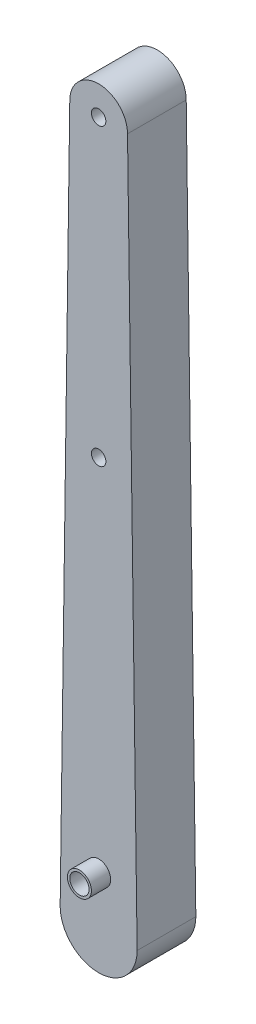
ISO-10303-21;
HEADER;
FILE_DESCRIPTION(('STEP AP214'),'2;1');
FILE_NAME('part.step','',(''),(''),'','','');
FILE_SCHEMA(('AUTOMOTIVE_DESIGN { 1 0 10303 214 1 1 1 1 }'));
ENDSEC;
DATA;
#1=APPLICATION_CONTEXT('core data for automotive mechanical design processes');
#2=APPLICATION_PROTOCOL_DEFINITION('international standard','automotive_design',2000,#1);
#3=PRODUCT_CONTEXT('',#1,'mechanical');
#4=PRODUCT('Part','Part','',(#3));
#5=PRODUCT_RELATED_PRODUCT_CATEGORY('part','',(#4));
#6=PRODUCT_DEFINITION_FORMATION('','',#4);
#7=PRODUCT_DEFINITION_CONTEXT('part definition',#1,'design');
#8=PRODUCT_DEFINITION('design','',#6,#7);
#9=PRODUCT_DEFINITION_SHAPE('','',#8);
#10=(LENGTH_UNIT() NAMED_UNIT(*) SI_UNIT(.MILLI.,.METRE.));
#11=(NAMED_UNIT(*) PLANE_ANGLE_UNIT() SI_UNIT($,.RADIAN.));
#12=(NAMED_UNIT(*) SI_UNIT($,.STERADIAN.) SOLID_ANGLE_UNIT());
#13=UNCERTAINTY_MEASURE_WITH_UNIT(LENGTH_MEASURE(1.E-05),#10,'distance_accuracy_value','');
#14=(GEOMETRIC_REPRESENTATION_CONTEXT(3) GLOBAL_UNCERTAINTY_ASSIGNED_CONTEXT((#13)) GLOBAL_UNIT_ASSIGNED_CONTEXT((#10,
#11,#12)) REPRESENTATION_CONTEXT('',''));
#15=CARTESIAN_POINT('',(0.,0.,0.));
#16=DIRECTION('',(0.,0.,1.));
#17=DIRECTION('',(1.,0.,0.));
#18=AXIS2_PLACEMENT_3D('',#15,#16,#17);
#19=CARTESIAN_POINT('',(0.,-59.6412556053812,16.2));
#20=DIRECTION('',(0.,0.,-1.));
#21=DIRECTION('',(-1.,0.,0.));
#22=AXIS2_PLACEMENT_3D('',#19,#20,#21);
#23=CYLINDRICAL_SURFACE('',#22,2.5);
#24=CARTESIAN_POINT('',(0.,-59.6412556053812,16.2));
#25=DIRECTION('',(0.,0.,1.));
#26=DIRECTION('',(1.,0.,0.));
#27=AXIS2_PLACEMENT_3D('',#24,#25,#26);
#28=CIRCLE('',#27,2.5);
#29=CARTESIAN_POINT('',(2.5,-59.6412556053812,16.2));
#30=VERTEX_POINT('',#29);
#31=EDGE_CURVE('E11',#30,#30,#28,.T.);
#32=ORIENTED_EDGE('',*,*,#31,.F.);
#33=EDGE_LOOP('',(#32));
#34=FACE_BOUND('',#33,.T.);
#35=CARTESIAN_POINT('',(0.,-59.6412556053812,12.2));
#36=DIRECTION('',(0.,0.,1.));
#37=DIRECTION('',(1.,0.,0.));
#38=AXIS2_PLACEMENT_3D('',#35,#36,#37);
#39=CIRCLE('',#38,2.5);
#40=CARTESIAN_POINT('',(2.5,-59.6412556053812,12.2));
#41=VERTEX_POINT('',#40);
#42=EDGE_CURVE('E48',#41,#41,#39,.T.);
#43=ORIENTED_EDGE('',*,*,#42,.T.);
#44=EDGE_LOOP('',(#43));
#45=FACE_BOUND('',#44,.T.);
#46=ADVANCED_FACE('F45',(#34,#45),#23,.T.);
#47=CARTESIAN_POINT('',(0.,-59.6412556053812,16.2));
#48=DIRECTION('',(0.,0.,1.));
#49=DIRECTION('',(1.,0.,0.));
#50=AXIS2_PLACEMENT_3D('',#47,#48,#49);
#51=PLANE('',#50);
#52=CARTESIAN_POINT('',(0.,-59.6412556053812,16.2));
#53=DIRECTION('',(0.,0.,1.));
#54=DIRECTION('',(1.,0.,0.));
#55=AXIS2_PLACEMENT_3D('',#52,#53,#54);
#56=CIRCLE('',#55,2.);
#57=CARTESIAN_POINT('',(2.,-59.6412556053812,16.2));
#58=VERTEX_POINT('',#57);
#59=EDGE_CURVE('E55',#58,#58,#56,.T.);
#60=ORIENTED_EDGE('',*,*,#59,.F.);
#61=EDGE_LOOP('',(#60));
#62=FACE_BOUND('',#61,.T.);
#63=ORIENTED_EDGE('',*,*,#31,.T.);
#64=EDGE_LOOP('',(#63));
#65=FACE_BOUND('',#64,.T.);
#66=ADVANCED_FACE('F73',(#62,#65),#51,.T.);
#67=CARTESIAN_POINT('',(0.,-59.6412556053812,12.2));
#68=DIRECTION('',(0.,0.,1.));
#69=DIRECTION('',(1.,0.,0.));
#70=AXIS2_PLACEMENT_3D('',#67,#68,#69);
#71=PLANE('',#70);
#72=CARTESIAN_POINT('',(0.,-59.6412556053812,12.2));
#73=DIRECTION('',(0.,0.,1.));
#74=DIRECTION('',(1.,0.,0.));
#75=AXIS2_PLACEMENT_3D('',#72,#73,#74);
#76=CIRCLE('',#75,2.);
#77=CARTESIAN_POINT('',(2.,-59.6412556053812,12.2));
#78=VERTEX_POINT('',#77);
#79=EDGE_CURVE('E59',#78,#78,#76,.T.);
#80=ORIENTED_EDGE('',*,*,#79,.T.);
#81=EDGE_LOOP('',(#80));
#82=FACE_BOUND('',#81,.T.);
#83=ORIENTED_EDGE('',*,*,#42,.F.);
#84=EDGE_LOOP('',(#83));
#85=FACE_BOUND('',#84,.T.);
#86=ADVANCED_FACE('F63',(#82,#85),#71,.F.);
#87=CARTESIAN_POINT('',(0.,-59.6412556053812,14.2));
#88=DIRECTION('',(0.,0.,1.));
#89=DIRECTION('',(1.,0.,0.));
#90=AXIS2_PLACEMENT_3D('',#87,#88,#89);
#91=CYLINDRICAL_SURFACE('',#90,2.);
#92=ORIENTED_EDGE('',*,*,#59,.T.);
#93=EDGE_LOOP('',(#92));
#94=FACE_BOUND('',#93,.T.);
#95=ORIENTED_EDGE('',*,*,#79,.F.);
#96=EDGE_LOOP('',(#95));
#97=FACE_BOUND('',#96,.T.);
#98=ADVANCED_FACE('F66',(#94,#97),#91,.F.);
#99=CLOSED_SHELL('',(#46,#66,#86,#98));
#100=MANIFOLD_SOLID_BREP('B2',#99);
#101=CARTESIAN_POINT('',(0.,76.3587443946188,12.2));
#102=DIRECTION('',(0.,0.,1.));
#103=DIRECTION('',(1.,0.,0.));
#104=AXIS2_PLACEMENT_3D('',#101,#102,#103);
#105=PLANE('',#104);
#106=CARTESIAN_POINT('',(0.,15.1100019933917,12.2));
#107=DIRECTION('',(0.,0.,1.));
#108=DIRECTION('',(1.,0.,0.));
#109=AXIS2_PLACEMENT_3D('',#106,#107,#108);
#110=CIRCLE('',#109,1.5);
#111=CARTESIAN_POINT('',(1.5,15.1100019933917,12.2));
#112=VERTEX_POINT('',#111);
#113=EDGE_CURVE('E202',#112,#112,#110,.T.);
#114=ORIENTED_EDGE('',*,*,#113,.F.);
#115=EDGE_LOOP('',(#114));
#116=FACE_BOUND('',#115,.T.);
#117=CARTESIAN_POINT('',(0.,-59.6412556053812,12.2));
#118=DIRECTION('',(0.,0.,1.));
#119=DIRECTION('',(1.,0.,0.));
#120=AXIS2_PLACEMENT_3D('',#117,#118,#119);
#121=CIRCLE('',#120,2.);
#122=CARTESIAN_POINT('',(2.,-59.6412556053812,12.2));
#123=VERTEX_POINT('',#122);
#124=EDGE_CURVE('E194',#123,#123,#121,.T.);
#125=ORIENTED_EDGE('',*,*,#124,.F.);
#126=EDGE_LOOP('',(#125));
#127=FACE_BOUND('',#126,.T.);
#128=CARTESIAN_POINT('',(0.,76.3587443946188,12.2));
#129=DIRECTION('',(0.,0.,1.));
#130=DIRECTION('',(1.,0.,0.));
#131=AXIS2_PLACEMENT_3D('',#128,#129,#130);
#132=CIRCLE('',#131,6.);
#133=CARTESIAN_POINT('',(6.,76.3587443946189,12.2));
#134=VERTEX_POINT('',#133);
#135=CARTESIAN_POINT('',(-6.,76.3587443946188,12.2));
#136=VERTEX_POINT('',#135);
#137=EDGE_CURVE('E163',#134,#136,#132,.T.);
#138=ORIENTED_EDGE('',*,*,#137,.T.);
#139=DIRECTION('',(-0.0136973450269747,-0.999906186969163,0.));
#140=VECTOR('',#139,1.);
#141=CARTESIAN_POINT('',(-6.,76.3587443946188,12.2));
#142=LINE('',#141,#140);
#143=CARTESIAN_POINT('',(-7.99999999999999,-69.6412556053812,12.2));
#144=VERTEX_POINT('',#143);
#145=EDGE_CURVE('E158',#136,#144,#142,.T.);
#146=ORIENTED_EDGE('',*,*,#145,.T.);
#147=CARTESIAN_POINT('',(0.,-69.6412556053812,12.2));
#148=DIRECTION('',(0.,0.,1.));
#149=DIRECTION('',(1.,0.,0.));
#150=AXIS2_PLACEMENT_3D('',#147,#148,#149);
#151=CIRCLE('',#150,8.);
#152=CARTESIAN_POINT('',(8.00000000000002,-69.6412556053812,12.2));
#153=VERTEX_POINT('',#152);
#154=EDGE_CURVE('E161',#144,#153,#151,.T.);
#155=ORIENTED_EDGE('',*,*,#154,.T.);
#156=DIRECTION('',(-0.013697345026975,0.999906186969163,0.));
#157=VECTOR('',#156,1.);
#158=CARTESIAN_POINT('',(6.,76.3587443946189,12.2));
#159=LINE('',#158,#157);
#160=EDGE_CURVE('E128',#153,#134,#159,.T.);
#161=ORIENTED_EDGE('',*,*,#160,.T.);
#162=EDGE_LOOP('',(#138,#146,#155,#161));
#163=FACE_BOUND('',#162,.T.);
#164=CARTESIAN_POINT('',(0.,76.3587443946188,12.2));
#165=DIRECTION('',(0.,0.,1.));
#166=DIRECTION('',(1.,0.,0.));
#167=AXIS2_PLACEMENT_3D('',#164,#165,#166);
#168=CIRCLE('',#167,1.5);
#169=CARTESIAN_POINT('',(1.5,76.3587443946188,12.2));
#170=VERTEX_POINT('',#169);
#171=EDGE_CURVE('E179',#170,#170,#168,.T.);
#172=ORIENTED_EDGE('',*,*,#171,.F.);
#173=EDGE_LOOP('',(#172));
#174=FACE_BOUND('',#173,.T.);
#175=ADVANCED_FACE('F110',(#116,#127,#163,#174),#105,.T.);
#176=CARTESIAN_POINT('',(0.,76.3587443946188,0.));
#177=DIRECTION('',(0.,0.,1.));
#178=DIRECTION('',(1.,0.,0.));
#179=AXIS2_PLACEMENT_3D('',#176,#177,#178);
#180=PLANE('',#179);
#181=CARTESIAN_POINT('',(0.,15.1100019933917,0.));
#182=DIRECTION('',(0.,0.,1.));
#183=DIRECTION('',(1.,0.,0.));
#184=AXIS2_PLACEMENT_3D('',#181,#182,#183);
#185=CIRCLE('',#184,1.5);
#186=CARTESIAN_POINT('',(1.5,15.1100019933917,0.));
#187=VERTEX_POINT('',#186);
#188=EDGE_CURVE('E114',#187,#187,#185,.T.);
#189=ORIENTED_EDGE('',*,*,#188,.T.);
#190=EDGE_LOOP('',(#189));
#191=FACE_BOUND('',#190,.T.);
#192=CARTESIAN_POINT('',(0.,-59.6412556053812,0.));
#193=DIRECTION('',(0.,0.,-1.));
#194=DIRECTION('',(-1.,0.,0.));
#195=AXIS2_PLACEMENT_3D('',#192,#193,#194);
#196=CIRCLE('',#195,2.);
#197=CARTESIAN_POINT('',(-2.,-59.6412556053812,0.));
#198=VERTEX_POINT('',#197);
#199=EDGE_CURVE('E199',#198,#198,#196,.T.);
#200=ORIENTED_EDGE('',*,*,#199,.F.);
#201=EDGE_LOOP('',(#200));
#202=FACE_BOUND('',#201,.T.);
#203=CARTESIAN_POINT('',(0.,76.3587443946188,0.));
#204=DIRECTION('',(0.,0.,1.));
#205=DIRECTION('',(1.,0.,0.));
#206=AXIS2_PLACEMENT_3D('',#203,#204,#205);
#207=CIRCLE('',#206,6.);
#208=CARTESIAN_POINT('',(6.,76.3587443946189,0.));
#209=VERTEX_POINT('',#208);
#210=CARTESIAN_POINT('',(-6.,76.3587443946188,0.));
#211=VERTEX_POINT('',#210);
#212=EDGE_CURVE('E176',#209,#211,#207,.T.);
#213=ORIENTED_EDGE('',*,*,#212,.F.);
#214=DIRECTION('',(-0.013697345026975,0.999906186969163,0.));
#215=VECTOR('',#214,1.);
#216=CARTESIAN_POINT('',(6.,76.3587443946189,0.));
#217=LINE('',#216,#215);
#218=CARTESIAN_POINT('',(8.00000000000002,-69.6412556053812,0.));
#219=VERTEX_POINT('',#218);
#220=EDGE_CURVE('E151',#219,#209,#217,.T.);
#221=ORIENTED_EDGE('',*,*,#220,.F.);
#222=CARTESIAN_POINT('',(0.,-69.6412556053812,0.));
#223=DIRECTION('',(0.,0.,1.));
#224=DIRECTION('',(1.,0.,0.));
#225=AXIS2_PLACEMENT_3D('',#222,#223,#224);
#226=CIRCLE('',#225,8.);
#227=CARTESIAN_POINT('',(-7.99999999999999,-69.6412556053812,0.));
#228=VERTEX_POINT('',#227);
#229=EDGE_CURVE('E145',#228,#219,#226,.T.);
#230=ORIENTED_EDGE('',*,*,#229,.F.);
#231=DIRECTION('',(-0.0136973450269747,-0.999906186969163,0.));
#232=VECTOR('',#231,1.);
#233=CARTESIAN_POINT('',(-6.,76.3587443946188,0.));
#234=LINE('',#233,#232);
#235=EDGE_CURVE('E167',#211,#228,#234,.T.);
#236=ORIENTED_EDGE('',*,*,#235,.F.);
#237=EDGE_LOOP('',(#213,#221,#230,#236));
#238=FACE_BOUND('',#237,.T.);
#239=CARTESIAN_POINT('',(0.,76.3587443946188,0.));
#240=DIRECTION('',(0.,0.,1.));
#241=DIRECTION('',(1.,0.,0.));
#242=AXIS2_PLACEMENT_3D('',#239,#240,#241);
#243=CIRCLE('',#242,1.5);
#244=CARTESIAN_POINT('',(1.5,76.3587443946188,0.));
#245=VERTEX_POINT('',#244);
#246=EDGE_CURVE('E191',#245,#245,#243,.T.);
#247=ORIENTED_EDGE('',*,*,#246,.T.);
#248=EDGE_LOOP('',(#247));
#249=FACE_BOUND('',#248,.T.);
#250=ADVANCED_FACE('F187',(#191,#202,#238,#249),#180,.F.);
#251=CARTESIAN_POINT('',(0.,76.3587443946188,12.2));
#252=DIRECTION('',(0.,0.,-1.));
#253=DIRECTION('',(-1.,0.,0.));
#254=AXIS2_PLACEMENT_3D('',#251,#252,#253);
#255=CYLINDRICAL_SURFACE('',#254,6.);
#256=ORIENTED_EDGE('',*,*,#212,.T.);
#257=DIRECTION('',(0.,0.,-1.));
#258=VECTOR('',#257,1.);
#259=CARTESIAN_POINT('',(-6.,76.3587443946188,12.2));
#260=LINE('',#259,#258);
#261=EDGE_CURVE('E43',#136,#211,#260,.T.);
#262=ORIENTED_EDGE('',*,*,#261,.F.);
#263=ORIENTED_EDGE('',*,*,#137,.F.);
#264=DIRECTION('',(0.,0.,-1.));
#265=VECTOR('',#264,1.);
#266=CARTESIAN_POINT('',(6.,76.3587443946189,12.2));
#267=LINE('',#266,#265);
#268=EDGE_CURVE('E172',#134,#209,#267,.T.);
#269=ORIENTED_EDGE('',*,*,#268,.T.);
#270=EDGE_LOOP('',(#256,#262,#263,#269));
#271=FACE_BOUND('',#270,.T.);
#272=ADVANCED_FACE('F112',(#271),#255,.T.);
#273=CARTESIAN_POINT('',(-6.,76.3587443946188,12.2));
#274=DIRECTION('',(0.999906186969164,-0.0136973450269747,0.));
#275=DIRECTION('',(0.0136973450269747,0.999906186969164,0.));
#276=AXIS2_PLACEMENT_3D('',#273,#274,#275);
#277=PLANE('',#276);
#278=ORIENTED_EDGE('',*,*,#235,.T.);
#279=DIRECTION('',(0.,0.,-1.));
#280=VECTOR('',#279,1.);
#281=CARTESIAN_POINT('',(-7.99999999999999,-69.6412556053812,12.2));
#282=LINE('',#281,#280);
#283=EDGE_CURVE('E120',#144,#228,#282,.T.);
#284=ORIENTED_EDGE('',*,*,#283,.F.);
#285=ORIENTED_EDGE('',*,*,#145,.F.);
#286=ORIENTED_EDGE('',*,*,#261,.T.);
#287=EDGE_LOOP('',(#278,#284,#285,#286));
#288=FACE_BOUND('',#287,.T.);
#289=ADVANCED_FACE('F166',(#288),#277,.F.);
#290=CARTESIAN_POINT('',(0.,-69.6412556053812,12.2));
#291=DIRECTION('',(0.,0.,-1.));
#292=DIRECTION('',(-1.,0.,0.));
#293=AXIS2_PLACEMENT_3D('',#290,#291,#292);
#294=CYLINDRICAL_SURFACE('',#293,8.);
#295=ORIENTED_EDGE('',*,*,#229,.T.);
#296=DIRECTION('',(0.,0.,-1.));
#297=VECTOR('',#296,1.);
#298=CARTESIAN_POINT('',(8.00000000000002,-69.6412556053812,12.2));
#299=LINE('',#298,#297);
#300=EDGE_CURVE('E168',#153,#219,#299,.T.);
#301=ORIENTED_EDGE('',*,*,#300,.F.);
#302=ORIENTED_EDGE('',*,*,#154,.F.);
#303=ORIENTED_EDGE('',*,*,#283,.T.);
#304=EDGE_LOOP('',(#295,#301,#302,#303));
#305=FACE_BOUND('',#304,.T.);
#306=ADVANCED_FACE('F170',(#305),#294,.T.);
#307=CARTESIAN_POINT('',(6.,76.3587443946189,12.2));
#308=DIRECTION('',(-0.999906186969164,-0.013697345026975,0.));
#309=DIRECTION('',(0.013697345026975,-0.999906186969164,0.));
#310=AXIS2_PLACEMENT_3D('',#307,#308,#309);
#311=PLANE('',#310);
#312=ORIENTED_EDGE('',*,*,#220,.T.);
#313=ORIENTED_EDGE('',*,*,#268,.F.);
#314=ORIENTED_EDGE('',*,*,#160,.F.);
#315=ORIENTED_EDGE('',*,*,#300,.T.);
#316=EDGE_LOOP('',(#312,#313,#314,#315));
#317=FACE_BOUND('',#316,.T.);
#318=ADVANCED_FACE('F184',(#317),#311,.F.);
#319=CARTESIAN_POINT('',(0.,76.3587443946188,12.2));
#320=DIRECTION('',(0.,0.,-1.));
#321=DIRECTION('',(-1.,0.,0.));
#322=AXIS2_PLACEMENT_3D('',#319,#320,#321);
#323=CYLINDRICAL_SURFACE('',#322,1.5);
#324=ORIENTED_EDGE('',*,*,#171,.T.);
#325=EDGE_LOOP('',(#324));
#326=FACE_BOUND('',#325,.T.);
#327=ORIENTED_EDGE('',*,*,#246,.F.);
#328=EDGE_LOOP('',(#327));
#329=FACE_BOUND('',#328,.T.);
#330=ADVANCED_FACE('F218',(#326,#329),#323,.F.);
#331=CARTESIAN_POINT('',(0.,-59.6412556053812,20.));
#332=DIRECTION('',(0.,0.,-1.));
#333=DIRECTION('',(-1.,0.,0.));
#334=AXIS2_PLACEMENT_3D('',#331,#332,#333);
#335=CYLINDRICAL_SURFACE('',#334,2.);
#336=ORIENTED_EDGE('',*,*,#124,.T.);
#337=EDGE_LOOP('',(#336));
#338=FACE_BOUND('',#337,.T.);
#339=ORIENTED_EDGE('',*,*,#199,.T.);
#340=EDGE_LOOP('',(#339));
#341=FACE_BOUND('',#340,.T.);
#342=ADVANCED_FACE('F213',(#338,#341),#335,.F.);
#343=CARTESIAN_POINT('',(0.,15.1100019933917,-7.8));
#344=DIRECTION('',(0.,0.,1.));
#345=DIRECTION('',(1.,0.,0.));
#346=AXIS2_PLACEMENT_3D('',#343,#344,#345);
#347=CYLINDRICAL_SURFACE('',#346,1.5);
#348=ORIENTED_EDGE('',*,*,#113,.T.);
#349=EDGE_LOOP('',(#348));
#350=FACE_BOUND('',#349,.T.);
#351=ORIENTED_EDGE('',*,*,#188,.F.);
#352=EDGE_LOOP('',(#351));
#353=FACE_BOUND('',#352,.T.);
#354=ADVANCED_FACE('F211',(#350,#353),#347,.F.);
#355=CLOSED_SHELL('',(#175,#250,#272,#289,#306,#318,#330,#342,#354));
#356=MANIFOLD_SOLID_BREP('B6',#355);
#357=ADVANCED_BREP_SHAPE_REPRESENTATION('',(#18,#100,#356),#14);
#358=SHAPE_DEFINITION_REPRESENTATION(#9,#357);
ENDSEC;
END-ISO-10303-21;
